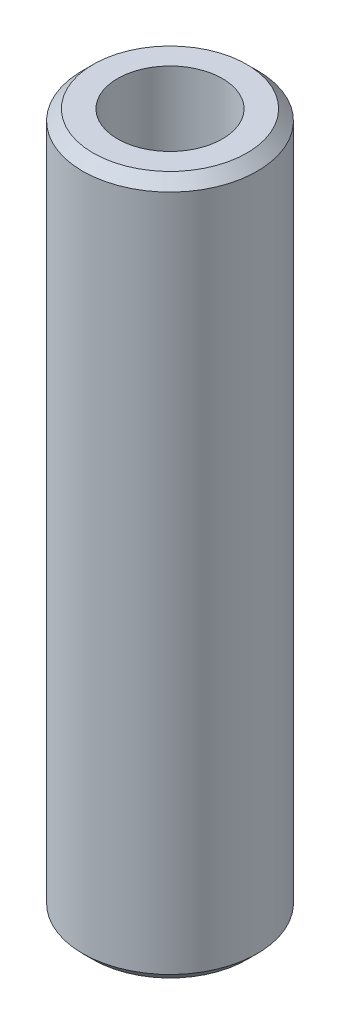
ISO-10303-21;
HEADER;
FILE_DESCRIPTION(('STEP AP214'),'2;1');
FILE_NAME('part.step','',(''),(''),'','','');
FILE_SCHEMA(('AUTOMOTIVE_DESIGN { 1 0 10303 214 1 1 1 1 }'));
ENDSEC;
DATA;
#1=APPLICATION_CONTEXT('core data for automotive mechanical design processes');
#2=APPLICATION_PROTOCOL_DEFINITION('international standard','automotive_design',2000,#1);
#3=PRODUCT_CONTEXT('',#1,'mechanical');
#4=PRODUCT('Part','Part','',(#3));
#5=PRODUCT_RELATED_PRODUCT_CATEGORY('part','',(#4));
#6=PRODUCT_DEFINITION_FORMATION('','',#4);
#7=PRODUCT_DEFINITION_CONTEXT('part definition',#1,'design');
#8=PRODUCT_DEFINITION('design','',#6,#7);
#9=PRODUCT_DEFINITION_SHAPE('','',#8);
#10=(LENGTH_UNIT() NAMED_UNIT(*) SI_UNIT(.MILLI.,.METRE.));
#11=(NAMED_UNIT(*) PLANE_ANGLE_UNIT() SI_UNIT($,.RADIAN.));
#12=(NAMED_UNIT(*) SI_UNIT($,.STERADIAN.) SOLID_ANGLE_UNIT());
#13=UNCERTAINTY_MEASURE_WITH_UNIT(LENGTH_MEASURE(1.E-05),#10,'distance_accuracy_value','');
#14=(GEOMETRIC_REPRESENTATION_CONTEXT(3) GLOBAL_UNCERTAINTY_ASSIGNED_CONTEXT((#13)) GLOBAL_UNIT_ASSIGNED_CONTEXT((#10,
#11,#12)) REPRESENTATION_CONTEXT('',''));
#15=CARTESIAN_POINT('',(0.,0.,0.));
#16=DIRECTION('',(0.,0.,1.));
#17=DIRECTION('',(1.,0.,0.));
#18=AXIS2_PLACEMENT_3D('',#15,#16,#17);
#19=CARTESIAN_POINT('',(0.,20.,0.));
#20=DIRECTION('',(0.,1.,0.));
#21=DIRECTION('',(0.,0.,1.));
#22=AXIS2_PLACEMENT_3D('',#19,#20,#21);
#23=PLANE('',#22);
#24=CARTESIAN_POINT('',(0.,20.,0.));
#25=DIRECTION('',(0.,1.,0.));
#26=DIRECTION('',(0.,0.,1.));
#27=AXIS2_PLACEMENT_3D('',#24,#25,#26);
#28=CIRCLE('',#27,2.2);
#29=CARTESIAN_POINT('',(0.,20.,2.2));
#30=VERTEX_POINT('',#29);
#31=EDGE_CURVE('E10',#30,#30,#28,.T.);
#32=ORIENTED_EDGE('',*,*,#31,.T.);
#33=EDGE_LOOP('',(#32));
#34=FACE_BOUND('',#33,.T.);
#35=CARTESIAN_POINT('',(0.,20.,0.));
#36=DIRECTION('',(0.,1.,0.));
#37=DIRECTION('',(0.,0.,1.));
#38=AXIS2_PLACEMENT_3D('',#35,#36,#37);
#39=CIRCLE('',#38,1.5);
#40=CARTESIAN_POINT('',(0.,20.,1.5));
#41=VERTEX_POINT('',#40);
#42=EDGE_CURVE('E60',#41,#41,#39,.T.);
#43=ORIENTED_EDGE('',*,*,#42,.F.);
#44=EDGE_LOOP('',(#43));
#45=FACE_BOUND('',#44,.T.);
#46=ADVANCED_FACE('F39',(#34,#45),#23,.T.);
#47=CARTESIAN_POINT('',(0.,0.,0.));
#48=DIRECTION('',(0.,1.,0.));
#49=DIRECTION('',(0.,0.,1.));
#50=AXIS2_PLACEMENT_3D('',#47,#48,#49);
#51=PLANE('',#50);
#52=CARTESIAN_POINT('',(0.,0.,0.));
#53=DIRECTION('',(0.,1.,0.));
#54=DIRECTION('',(0.,0.,1.));
#55=AXIS2_PLACEMENT_3D('',#52,#53,#54);
#56=CIRCLE('',#55,2.2);
#57=CARTESIAN_POINT('',(0.,0.,2.2));
#58=VERTEX_POINT('',#57);
#59=EDGE_CURVE('E47',#58,#58,#56,.F.);
#60=ORIENTED_EDGE('',*,*,#59,.T.);
#61=EDGE_LOOP('',(#60));
#62=FACE_BOUND('',#61,.T.);
#63=CARTESIAN_POINT('',(0.,0.,0.));
#64=DIRECTION('',(0.,1.,0.));
#65=DIRECTION('',(0.,0.,1.));
#66=AXIS2_PLACEMENT_3D('',#63,#64,#65);
#67=CIRCLE('',#66,1.5);
#68=CARTESIAN_POINT('',(0.,0.,1.5));
#69=VERTEX_POINT('',#68);
#70=EDGE_CURVE('E61',#69,#69,#67,.T.);
#71=ORIENTED_EDGE('',*,*,#70,.T.);
#72=EDGE_LOOP('',(#71));
#73=FACE_BOUND('',#72,.T.);
#74=ADVANCED_FACE('F71',(#62,#73),#51,.F.);
#75=CARTESIAN_POINT('',(0.,20.,0.));
#76=DIRECTION('',(0.,-1.,0.));
#77=DIRECTION('',(0.,0.,-1.));
#78=AXIS2_PLACEMENT_3D('',#75,#76,#77);
#79=CYLINDRICAL_SURFACE('',#78,2.5);
#80=CARTESIAN_POINT('',(0.,0.299999999999998,0.));
#81=DIRECTION('',(0.,1.,0.));
#82=DIRECTION('',(0.,0.,1.));
#83=AXIS2_PLACEMENT_3D('',#80,#81,#82);
#84=CIRCLE('',#83,2.5);
#85=CARTESIAN_POINT('',(0.,0.299999999999998,2.5));
#86=VERTEX_POINT('',#85);
#87=EDGE_CURVE('E51',#86,#86,#84,.T.);
#88=ORIENTED_EDGE('',*,*,#87,.T.);
#89=EDGE_LOOP('',(#88));
#90=FACE_BOUND('',#89,.T.);
#91=CARTESIAN_POINT('',(0.,19.7,0.));
#92=DIRECTION('',(0.,1.,0.));
#93=DIRECTION('',(0.,0.,1.));
#94=AXIS2_PLACEMENT_3D('',#91,#92,#93);
#95=CIRCLE('',#94,2.5);
#96=CARTESIAN_POINT('',(0.,19.7,2.5));
#97=VERTEX_POINT('',#96);
#98=EDGE_CURVE('E55',#97,#97,#95,.F.);
#99=ORIENTED_EDGE('',*,*,#98,.T.);
#100=EDGE_LOOP('',(#99));
#101=FACE_BOUND('',#100,.T.);
#102=ADVANCED_FACE('F77',(#90,#101),#79,.T.);
#103=CARTESIAN_POINT('',(0.,20.,0.));
#104=DIRECTION('',(0.,-1.,0.));
#105=DIRECTION('',(0.,0.,-1.));
#106=AXIS2_PLACEMENT_3D('',#103,#104,#105);
#107=CYLINDRICAL_SURFACE('',#106,1.5);
#108=ORIENTED_EDGE('',*,*,#42,.T.);
#109=EDGE_LOOP('',(#108));
#110=FACE_BOUND('',#109,.T.);
#111=ORIENTED_EDGE('',*,*,#70,.F.);
#112=EDGE_LOOP('',(#111));
#113=FACE_BOUND('',#112,.T.);
#114=ADVANCED_FACE('F67',(#110,#113),#107,.F.);
#115=CARTESIAN_POINT('',(0.,0.299999999999998,0.));
#116=DIRECTION('',(0.,1.,0.));
#117=DIRECTION('',(0.,0.,1.));
#118=AXIS2_PLACEMENT_3D('',#115,#116,#117);
#119=CONICAL_SURFACE('',#118,2.5,0.785398163397447);
#120=ORIENTED_EDGE('',*,*,#59,.F.);
#121=EDGE_LOOP('',(#120));
#122=FACE_BOUND('',#121,.T.);
#123=ORIENTED_EDGE('',*,*,#87,.F.);
#124=EDGE_LOOP('',(#123));
#125=FACE_BOUND('',#124,.T.);
#126=ADVANCED_FACE('F84',(#122,#125),#119,.T.);
#127=CARTESIAN_POINT('',(0.,20.,0.));
#128=DIRECTION('',(0.,-1.,0.));
#129=DIRECTION('',(0.,0.,-1.));
#130=AXIS2_PLACEMENT_3D('',#127,#128,#129);
#131=CONICAL_SURFACE('',#130,2.2,0.785398163397447);
#132=ORIENTED_EDGE('',*,*,#98,.F.);
#133=EDGE_LOOP('',(#132));
#134=FACE_BOUND('',#133,.T.);
#135=ORIENTED_EDGE('',*,*,#31,.F.);
#136=EDGE_LOOP('',(#135));
#137=FACE_BOUND('',#136,.T.);
#138=ADVANCED_FACE('F42',(#134,#137),#131,.T.);
#139=CLOSED_SHELL('',(#46,#74,#102,#114,#126,#138));
#140=MANIFOLD_SOLID_BREP('B2',#139);
#141=ADVANCED_BREP_SHAPE_REPRESENTATION('',(#18,#140),#14);
#142=SHAPE_DEFINITION_REPRESENTATION(#9,#141);
ENDSEC;
END-ISO-10303-21;
